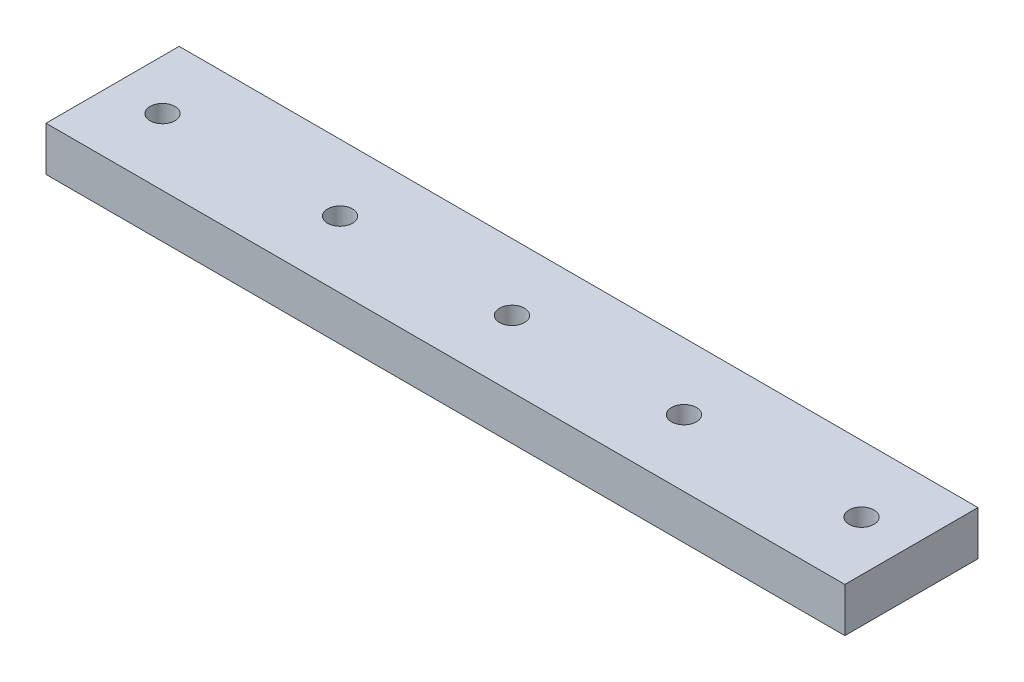
ISO-10303-21;
HEADER;
FILE_DESCRIPTION(('STEP AP214'),'2;1');
FILE_NAME('part.step','',(''),(''),'','','');
FILE_SCHEMA(('AUTOMOTIVE_DESIGN { 1 0 10303 214 1 1 1 1 }'));
ENDSEC;
DATA;
#1=APPLICATION_CONTEXT('core data for automotive mechanical design processes');
#2=APPLICATION_PROTOCOL_DEFINITION('international standard','automotive_design',2000,#1);
#3=PRODUCT_CONTEXT('',#1,'mechanical');
#4=PRODUCT('Part','Part','',(#3));
#5=PRODUCT_RELATED_PRODUCT_CATEGORY('part','',(#4));
#6=PRODUCT_DEFINITION_FORMATION('','',#4);
#7=PRODUCT_DEFINITION_CONTEXT('part definition',#1,'design');
#8=PRODUCT_DEFINITION('design','',#6,#7);
#9=PRODUCT_DEFINITION_SHAPE('','',#8);
#10=(LENGTH_UNIT() NAMED_UNIT(*) SI_UNIT(.MILLI.,.METRE.));
#11=(NAMED_UNIT(*) PLANE_ANGLE_UNIT() SI_UNIT($,.RADIAN.));
#12=(NAMED_UNIT(*) SI_UNIT($,.STERADIAN.) SOLID_ANGLE_UNIT());
#13=UNCERTAINTY_MEASURE_WITH_UNIT(LENGTH_MEASURE(1.E-05),#10,'distance_accuracy_value','');
#14=(GEOMETRIC_REPRESENTATION_CONTEXT(3) GLOBAL_UNCERTAINTY_ASSIGNED_CONTEXT((#13)) GLOBAL_UNIT_ASSIGNED_CONTEXT((#10,
#11,#12)) REPRESENTATION_CONTEXT('',''));
#15=CARTESIAN_POINT('',(0.,0.,0.));
#16=DIRECTION('',(0.,0.,1.));
#17=DIRECTION('',(1.,0.,0.));
#18=AXIS2_PLACEMENT_3D('',#15,#16,#17);
#19=CARTESIAN_POINT('',(0.,12.7,0.));
#20=DIRECTION('',(0.,1.,0.));
#21=DIRECTION('',(0.,0.,1.));
#22=AXIS2_PLACEMENT_3D('',#19,#20,#21);
#23=PLANE('',#22);
#24=CARTESIAN_POINT('',(163.5125,12.7,19.05));
#25=DIRECTION('',(0.,1.,0.));
#26=DIRECTION('',(0.,0.,1.));
#27=AXIS2_PLACEMENT_3D('',#24,#25,#26);
#28=CIRCLE('',#27,3.57187500000001);
#29=CARTESIAN_POINT('',(163.5125,12.7,22.621875));
#30=VERTEX_POINT('',#29);
#31=EDGE_CURVE('E133',#30,#30,#28,.T.);
#32=ORIENTED_EDGE('',*,*,#31,.F.);
#33=EDGE_LOOP('',(#32));
#34=FACE_BOUND('',#33,.T.);
#35=CARTESIAN_POINT('',(65.0875,12.7,19.05));
#36=DIRECTION('',(0.,1.,0.));
#37=DIRECTION('',(0.,0.,1.));
#38=AXIS2_PLACEMENT_3D('',#35,#36,#37);
#39=CIRCLE('',#38,3.57187500000001);
#40=CARTESIAN_POINT('',(65.0875,12.7,22.621875));
#41=VERTEX_POINT('',#40);
#42=EDGE_CURVE('E121',#41,#41,#39,.T.);
#43=ORIENTED_EDGE('',*,*,#42,.F.);
#44=EDGE_LOOP('',(#43));
#45=FACE_BOUND('',#44,.T.);
#46=DIRECTION('',(0.,0.,1.));
#47=VECTOR('',#46,1.);
#48=CARTESIAN_POINT('',(0.,12.7,0.));
#49=LINE('',#48,#47);
#50=CARTESIAN_POINT('',(0.,12.7,0.));
#51=VERTEX_POINT('',#50);
#52=CARTESIAN_POINT('',(0.,12.7,38.1));
#53=VERTEX_POINT('',#52);
#54=EDGE_CURVE('E91',#51,#53,#49,.T.);
#55=ORIENTED_EDGE('',*,*,#54,.T.);
#56=DIRECTION('',(1.,0.,0.));
#57=VECTOR('',#56,1.);
#58=CARTESIAN_POINT('',(0.,12.7,38.1));
#59=LINE('',#58,#57);
#60=CARTESIAN_POINT('',(228.6,12.7,38.1));
#61=VERTEX_POINT('',#60);
#62=EDGE_CURVE('E86',#53,#61,#59,.T.);
#63=ORIENTED_EDGE('',*,*,#62,.T.);
#64=DIRECTION('',(0.,0.,-1.));
#65=VECTOR('',#64,1.);
#66=CARTESIAN_POINT('',(228.6,12.7,0.));
#67=LINE('',#66,#65);
#68=CARTESIAN_POINT('',(228.6,12.7,0.));
#69=VERTEX_POINT('',#68);
#70=EDGE_CURVE('E89',#61,#69,#67,.T.);
#71=ORIENTED_EDGE('',*,*,#70,.T.);
#72=DIRECTION('',(-1.,0.,0.));
#73=VECTOR('',#72,1.);
#74=CARTESIAN_POINT('',(0.,12.7,0.));
#75=LINE('',#74,#73);
#76=EDGE_CURVE('E56',#69,#51,#75,.T.);
#77=ORIENTED_EDGE('',*,*,#76,.T.);
#78=EDGE_LOOP('',(#55,#63,#71,#77));
#79=FACE_BOUND('',#78,.T.);
#80=CARTESIAN_POINT('',(14.2875,12.7,19.05));
#81=DIRECTION('',(0.,1.,0.));
#82=DIRECTION('',(0.,0.,1.));
#83=AXIS2_PLACEMENT_3D('',#80,#81,#82);
#84=CIRCLE('',#83,3.571875);
#85=CARTESIAN_POINT('',(14.2875,12.7,22.621875));
#86=VERTEX_POINT('',#85);
#87=EDGE_CURVE('E106',#86,#86,#84,.T.);
#88=ORIENTED_EDGE('',*,*,#87,.F.);
#89=EDGE_LOOP('',(#88));
#90=FACE_BOUND('',#89,.T.);
#91=CARTESIAN_POINT('',(114.3,12.7,19.05));
#92=DIRECTION('',(0.,1.,0.));
#93=DIRECTION('',(0.,0.,1.));
#94=AXIS2_PLACEMENT_3D('',#91,#92,#93);
#95=CIRCLE('',#94,3.57187500000001);
#96=CARTESIAN_POINT('',(114.3,12.7,22.621875));
#97=VERTEX_POINT('',#96);
#98=EDGE_CURVE('E127',#97,#97,#95,.T.);
#99=ORIENTED_EDGE('',*,*,#98,.F.);
#100=EDGE_LOOP('',(#99));
#101=FACE_BOUND('',#100,.T.);
#102=CARTESIAN_POINT('',(214.3125,12.7,19.05));
#103=DIRECTION('',(0.,1.,0.));
#104=DIRECTION('',(0.,0.,1.));
#105=AXIS2_PLACEMENT_3D('',#102,#103,#104);
#106=CIRCLE('',#105,3.57187500000001);
#107=CARTESIAN_POINT('',(214.3125,12.7,22.621875));
#108=VERTEX_POINT('',#107);
#109=EDGE_CURVE('E139',#108,#108,#106,.T.);
#110=ORIENTED_EDGE('',*,*,#109,.F.);
#111=EDGE_LOOP('',(#110));
#112=FACE_BOUND('',#111,.T.);
#113=ADVANCED_FACE('F39',(#34,#45,#79,#90,#101,#112),#23,.T.);
#114=CARTESIAN_POINT('',(0.,0.,0.));
#115=DIRECTION('',(0.,1.,0.));
#116=DIRECTION('',(0.,0.,1.));
#117=AXIS2_PLACEMENT_3D('',#114,#115,#116);
#118=PLANE('',#117);
#119=DIRECTION('',(0.,0.,1.));
#120=VECTOR('',#119,1.);
#121=CARTESIAN_POINT('',(0.,0.,0.));
#122=LINE('',#121,#120);
#123=CARTESIAN_POINT('',(0.,0.,0.));
#124=VERTEX_POINT('',#123);
#125=CARTESIAN_POINT('',(0.,0.,38.1));
#126=VERTEX_POINT('',#125);
#127=EDGE_CURVE('E103',#124,#126,#122,.T.);
#128=ORIENTED_EDGE('',*,*,#127,.F.);
#129=DIRECTION('',(-1.,0.,0.));
#130=VECTOR('',#129,1.);
#131=CARTESIAN_POINT('',(0.,0.,0.));
#132=LINE('',#131,#130);
#133=CARTESIAN_POINT('',(228.6,0.,0.));
#134=VERTEX_POINT('',#133);
#135=EDGE_CURVE('E79',#134,#124,#132,.T.);
#136=ORIENTED_EDGE('',*,*,#135,.F.);
#137=DIRECTION('',(0.,0.,-1.));
#138=VECTOR('',#137,1.);
#139=CARTESIAN_POINT('',(228.6,0.,0.));
#140=LINE('',#139,#138);
#141=CARTESIAN_POINT('',(228.6,0.,38.1));
#142=VERTEX_POINT('',#141);
#143=EDGE_CURVE('E73',#142,#134,#140,.T.);
#144=ORIENTED_EDGE('',*,*,#143,.F.);
#145=DIRECTION('',(1.,0.,0.));
#146=VECTOR('',#145,1.);
#147=CARTESIAN_POINT('',(0.,0.,38.1));
#148=LINE('',#147,#146);
#149=EDGE_CURVE('E95',#126,#142,#148,.T.);
#150=ORIENTED_EDGE('',*,*,#149,.F.);
#151=EDGE_LOOP('',(#128,#136,#144,#150));
#152=FACE_BOUND('',#151,.T.);
#153=CARTESIAN_POINT('',(14.2875,0.,19.05));
#154=DIRECTION('',(0.,1.,0.));
#155=DIRECTION('',(0.,0.,1.));
#156=AXIS2_PLACEMENT_3D('',#153,#154,#155);
#157=CIRCLE('',#156,3.571875);
#158=CARTESIAN_POINT('',(14.2875,0.,22.621875));
#159=VERTEX_POINT('',#158);
#160=EDGE_CURVE('E118',#159,#159,#157,.T.);
#161=ORIENTED_EDGE('',*,*,#160,.T.);
#162=EDGE_LOOP('',(#161));
#163=FACE_BOUND('',#162,.T.);
#164=CARTESIAN_POINT('',(65.0875,0.,19.05));
#165=DIRECTION('',(0.,1.,0.));
#166=DIRECTION('',(0.,0.,1.));
#167=AXIS2_PLACEMENT_3D('',#164,#165,#166);
#168=CIRCLE('',#167,3.57187500000001);
#169=CARTESIAN_POINT('',(65.0875,0.,22.621875));
#170=VERTEX_POINT('',#169);
#171=EDGE_CURVE('E124',#170,#170,#168,.T.);
#172=ORIENTED_EDGE('',*,*,#171,.T.);
#173=EDGE_LOOP('',(#172));
#174=FACE_BOUND('',#173,.T.);
#175=CARTESIAN_POINT('',(114.3,0.,19.05));
#176=DIRECTION('',(0.,1.,0.));
#177=DIRECTION('',(0.,0.,1.));
#178=AXIS2_PLACEMENT_3D('',#175,#176,#177);
#179=CIRCLE('',#178,3.57187500000001);
#180=CARTESIAN_POINT('',(114.3,0.,22.621875));
#181=VERTEX_POINT('',#180);
#182=EDGE_CURVE('E130',#181,#181,#179,.T.);
#183=ORIENTED_EDGE('',*,*,#182,.T.);
#184=EDGE_LOOP('',(#183));
#185=FACE_BOUND('',#184,.T.);
#186=CARTESIAN_POINT('',(163.5125,0.,19.05));
#187=DIRECTION('',(0.,1.,0.));
#188=DIRECTION('',(0.,0.,1.));
#189=AXIS2_PLACEMENT_3D('',#186,#187,#188);
#190=CIRCLE('',#189,3.57187500000001);
#191=CARTESIAN_POINT('',(163.5125,0.,22.621875));
#192=VERTEX_POINT('',#191);
#193=EDGE_CURVE('E136',#192,#192,#190,.T.);
#194=ORIENTED_EDGE('',*,*,#193,.T.);
#195=EDGE_LOOP('',(#194));
#196=FACE_BOUND('',#195,.T.);
#197=CARTESIAN_POINT('',(214.3125,0.,19.05));
#198=DIRECTION('',(0.,1.,0.));
#199=DIRECTION('',(0.,0.,1.));
#200=AXIS2_PLACEMENT_3D('',#197,#198,#199);
#201=CIRCLE('',#200,3.57187500000001);
#202=CARTESIAN_POINT('',(214.3125,0.,22.621875));
#203=VERTEX_POINT('',#202);
#204=EDGE_CURVE('E142',#203,#203,#201,.T.);
#205=ORIENTED_EDGE('',*,*,#204,.T.);
#206=EDGE_LOOP('',(#205));
#207=FACE_BOUND('',#206,.T.);
#208=ADVANCED_FACE('F114',(#152,#163,#174,#185,#196,#207),#118,.F.);
#209=CARTESIAN_POINT('',(0.,12.7,0.));
#210=DIRECTION('',(1.,0.,0.));
#211=DIRECTION('',(0.,0.,-1.));
#212=AXIS2_PLACEMENT_3D('',#209,#210,#211);
#213=PLANE('',#212);
#214=ORIENTED_EDGE('',*,*,#127,.T.);
#215=DIRECTION('',(0.,-1.,0.));
#216=VECTOR('',#215,1.);
#217=CARTESIAN_POINT('',(0.,12.7,38.1));
#218=LINE('',#217,#216);
#219=EDGE_CURVE('E11',#53,#126,#218,.T.);
#220=ORIENTED_EDGE('',*,*,#219,.F.);
#221=ORIENTED_EDGE('',*,*,#54,.F.);
#222=DIRECTION('',(0.,-1.,0.));
#223=VECTOR('',#222,1.);
#224=CARTESIAN_POINT('',(0.,12.7,0.));
#225=LINE('',#224,#223);
#226=EDGE_CURVE('E99',#51,#124,#225,.T.);
#227=ORIENTED_EDGE('',*,*,#226,.T.);
#228=EDGE_LOOP('',(#214,#220,#221,#227));
#229=FACE_BOUND('',#228,.T.);
#230=ADVANCED_FACE('F41',(#229),#213,.F.);
#231=CARTESIAN_POINT('',(0.,12.7,38.1));
#232=DIRECTION('',(0.,0.,-1.));
#233=DIRECTION('',(-1.,0.,0.));
#234=AXIS2_PLACEMENT_3D('',#231,#232,#233);
#235=PLANE('',#234);
#236=ORIENTED_EDGE('',*,*,#149,.T.);
#237=DIRECTION('',(0.,-1.,0.));
#238=VECTOR('',#237,1.);
#239=CARTESIAN_POINT('',(228.6,12.7,38.1));
#240=LINE('',#239,#238);
#241=EDGE_CURVE('E48',#61,#142,#240,.T.);
#242=ORIENTED_EDGE('',*,*,#241,.F.);
#243=ORIENTED_EDGE('',*,*,#62,.F.);
#244=ORIENTED_EDGE('',*,*,#219,.T.);
#245=EDGE_LOOP('',(#236,#242,#243,#244));
#246=FACE_BOUND('',#245,.T.);
#247=ADVANCED_FACE('F94',(#246),#235,.F.);
#248=CARTESIAN_POINT('',(228.6,12.7,0.));
#249=DIRECTION('',(-1.,0.,0.));
#250=DIRECTION('',(0.,0.,1.));
#251=AXIS2_PLACEMENT_3D('',#248,#249,#250);
#252=PLANE('',#251);
#253=ORIENTED_EDGE('',*,*,#143,.T.);
#254=DIRECTION('',(0.,-1.,0.));
#255=VECTOR('',#254,1.);
#256=CARTESIAN_POINT('',(228.6,12.7,0.));
#257=LINE('',#256,#255);
#258=EDGE_CURVE('E96',#69,#134,#257,.T.);
#259=ORIENTED_EDGE('',*,*,#258,.F.);
#260=ORIENTED_EDGE('',*,*,#70,.F.);
#261=ORIENTED_EDGE('',*,*,#241,.T.);
#262=EDGE_LOOP('',(#253,#259,#260,#261));
#263=FACE_BOUND('',#262,.T.);
#264=ADVANCED_FACE('F97',(#263),#252,.F.);
#265=CARTESIAN_POINT('',(0.,12.7,0.));
#266=DIRECTION('',(0.,0.,1.));
#267=DIRECTION('',(1.,0.,0.));
#268=AXIS2_PLACEMENT_3D('',#265,#266,#267);
#269=PLANE('',#268);
#270=ORIENTED_EDGE('',*,*,#135,.T.);
#271=ORIENTED_EDGE('',*,*,#226,.F.);
#272=ORIENTED_EDGE('',*,*,#76,.F.);
#273=ORIENTED_EDGE('',*,*,#258,.T.);
#274=EDGE_LOOP('',(#270,#271,#272,#273));
#275=FACE_BOUND('',#274,.T.);
#276=ADVANCED_FACE('F111',(#275),#269,.F.);
#277=CARTESIAN_POINT('',(14.2875,12.7,19.05));
#278=DIRECTION('',(0.,-1.,0.));
#279=DIRECTION('',(0.,0.,-1.));
#280=AXIS2_PLACEMENT_3D('',#277,#278,#279);
#281=CYLINDRICAL_SURFACE('',#280,3.571875);
#282=ORIENTED_EDGE('',*,*,#87,.T.);
#283=EDGE_LOOP('',(#282));
#284=FACE_BOUND('',#283,.T.);
#285=ORIENTED_EDGE('',*,*,#160,.F.);
#286=EDGE_LOOP('',(#285));
#287=FACE_BOUND('',#286,.T.);
#288=ADVANCED_FACE('F161',(#284,#287),#281,.F.);
#289=CARTESIAN_POINT('',(65.0875,12.7,19.05));
#290=DIRECTION('',(0.,-1.,0.));
#291=DIRECTION('',(0.,0.,-1.));
#292=AXIS2_PLACEMENT_3D('',#289,#290,#291);
#293=CYLINDRICAL_SURFACE('',#292,3.57187500000001);
#294=ORIENTED_EDGE('',*,*,#42,.T.);
#295=EDGE_LOOP('',(#294));
#296=FACE_BOUND('',#295,.T.);
#297=ORIENTED_EDGE('',*,*,#171,.F.);
#298=EDGE_LOOP('',(#297));
#299=FACE_BOUND('',#298,.T.);
#300=ADVANCED_FACE('F207',(#296,#299),#293,.F.);
#301=CARTESIAN_POINT('',(114.3,12.7,19.05));
#302=DIRECTION('',(0.,-1.,0.));
#303=DIRECTION('',(0.,0.,-1.));
#304=AXIS2_PLACEMENT_3D('',#301,#302,#303);
#305=CYLINDRICAL_SURFACE('',#304,3.57187500000001);
#306=ORIENTED_EDGE('',*,*,#98,.T.);
#307=EDGE_LOOP('',(#306));
#308=FACE_BOUND('',#307,.T.);
#309=ORIENTED_EDGE('',*,*,#182,.F.);
#310=EDGE_LOOP('',(#309));
#311=FACE_BOUND('',#310,.T.);
#312=ADVANCED_FACE('F216',(#308,#311),#305,.F.);
#313=CARTESIAN_POINT('',(163.5125,12.7,19.05));
#314=DIRECTION('',(0.,-1.,0.));
#315=DIRECTION('',(0.,0.,-1.));
#316=AXIS2_PLACEMENT_3D('',#313,#314,#315);
#317=CYLINDRICAL_SURFACE('',#316,3.57187500000001);
#318=ORIENTED_EDGE('',*,*,#31,.T.);
#319=EDGE_LOOP('',(#318));
#320=FACE_BOUND('',#319,.T.);
#321=ORIENTED_EDGE('',*,*,#193,.F.);
#322=EDGE_LOOP('',(#321));
#323=FACE_BOUND('',#322,.T.);
#324=ADVANCED_FACE('F224',(#320,#323),#317,.F.);
#325=CARTESIAN_POINT('',(214.3125,12.7,19.05));
#326=DIRECTION('',(0.,-1.,0.));
#327=DIRECTION('',(0.,0.,-1.));
#328=AXIS2_PLACEMENT_3D('',#325,#326,#327);
#329=CYLINDRICAL_SURFACE('',#328,3.57187500000001);
#330=ORIENTED_EDGE('',*,*,#109,.T.);
#331=EDGE_LOOP('',(#330));
#332=FACE_BOUND('',#331,.T.);
#333=ORIENTED_EDGE('',*,*,#204,.F.);
#334=EDGE_LOOP('',(#333));
#335=FACE_BOUND('',#334,.T.);
#336=ADVANCED_FACE('F148',(#332,#335),#329,.F.);
#337=CLOSED_SHELL('',(#113,#208,#230,#247,#264,#276,#288,#300,#312,#324,#336));
#338=MANIFOLD_SOLID_BREP('B2',#337);
#339=ADVANCED_BREP_SHAPE_REPRESENTATION('',(#18,#338),#14);
#340=SHAPE_DEFINITION_REPRESENTATION(#9,#339);
ENDSEC;
END-ISO-10303-21;
